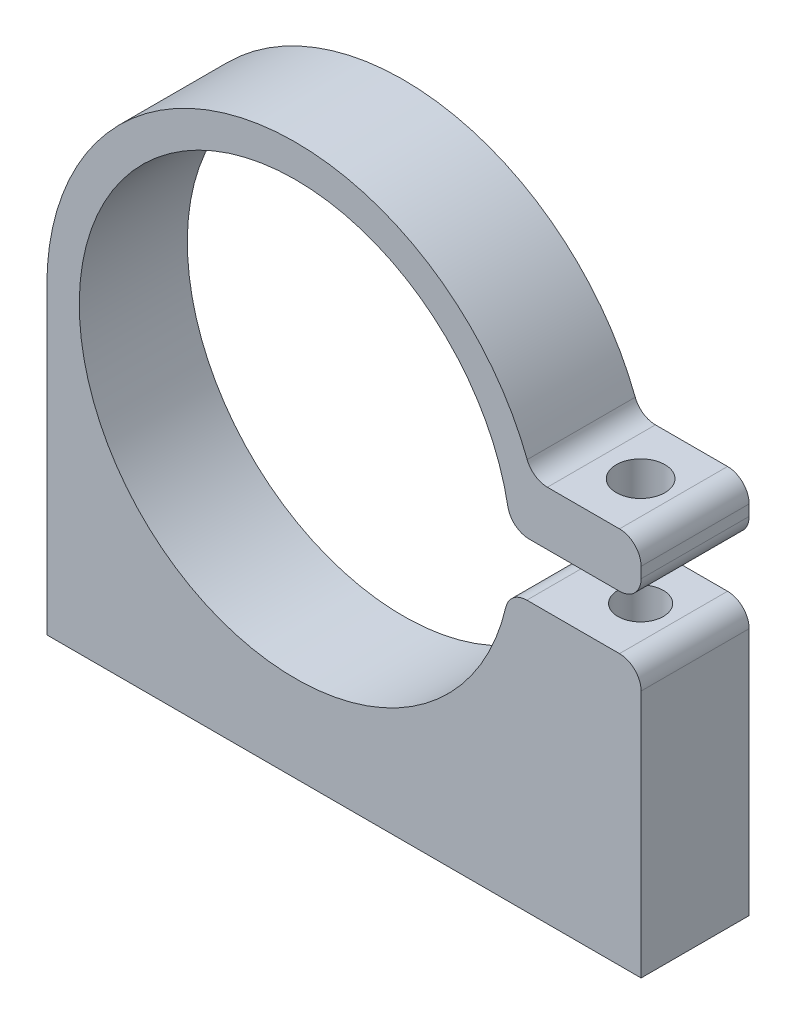
ISO-10303-21;
HEADER;
FILE_DESCRIPTION(('STEP AP214'),'2;1');
FILE_NAME('part.step','',(''),(''),'','','');
FILE_SCHEMA(('AUTOMOTIVE_DESIGN { 1 0 10303 214 1 1 1 1 }'));
ENDSEC;
DATA;
#1=APPLICATION_CONTEXT('core data for automotive mechanical design processes');
#2=APPLICATION_PROTOCOL_DEFINITION('international standard','automotive_design',2000,#1);
#3=PRODUCT_CONTEXT('',#1,'mechanical');
#4=PRODUCT('Part','Part','',(#3));
#5=PRODUCT_RELATED_PRODUCT_CATEGORY('part','',(#4));
#6=PRODUCT_DEFINITION_FORMATION('','',#4);
#7=PRODUCT_DEFINITION_CONTEXT('part definition',#1,'design');
#8=PRODUCT_DEFINITION('design','',#6,#7);
#9=PRODUCT_DEFINITION_SHAPE('','',#8);
#10=(LENGTH_UNIT() NAMED_UNIT(*) SI_UNIT(.MILLI.,.METRE.));
#11=(NAMED_UNIT(*) PLANE_ANGLE_UNIT() SI_UNIT($,.RADIAN.));
#12=(NAMED_UNIT(*) SI_UNIT($,.STERADIAN.) SOLID_ANGLE_UNIT());
#13=UNCERTAINTY_MEASURE_WITH_UNIT(LENGTH_MEASURE(1.E-05),#10,'distance_accuracy_value','');
#14=(GEOMETRIC_REPRESENTATION_CONTEXT(3) GLOBAL_UNCERTAINTY_ASSIGNED_CONTEXT((#13)) GLOBAL_UNIT_ASSIGNED_CONTEXT((#10,
#11,#12)) REPRESENTATION_CONTEXT('',''));
#15=CARTESIAN_POINT('',(0.,0.,0.));
#16=DIRECTION('',(0.,0.,1.));
#17=DIRECTION('',(1.,0.,0.));
#18=AXIS2_PLACEMENT_3D('',#15,#16,#17);
#19=CARTESIAN_POINT('',(32.,7.,10.));
#20=DIRECTION('',(0.,-1.,0.));
#21=DIRECTION('',(1.,0.,0.));
#22=AXIS2_PLACEMENT_3D('',#19,#20,#21);
#23=PLANE('',#22);
#24=DIRECTION('',(-1.,0.,0.));
#25=VECTOR('',#24,1.);
#26=CARTESIAN_POINT('',(32.,7.,10.));
#27=LINE('',#26,#25);
#28=CARTESIAN_POINT('',(30.,7.,10.));
#29=VERTEX_POINT('',#28);
#30=CARTESIAN_POINT('',(23.3238075793812,7.,10.));
#31=VERTEX_POINT('',#30);
#32=EDGE_CURVE('E195',#29,#31,#27,.T.);
#33=ORIENTED_EDGE('',*,*,#32,.F.);
#34=DIRECTION('',(0.,0.,-1.));
#35=VECTOR('',#34,1.);
#36=CARTESIAN_POINT('',(30.,7.,10.));
#37=LINE('',#36,#35);
#38=CARTESIAN_POINT('',(30.,7.,0.));
#39=VERTEX_POINT('',#38);
#40=EDGE_CURVE('E257',#29,#39,#37,.T.);
#41=ORIENTED_EDGE('',*,*,#40,.T.);
#42=DIRECTION('',(-1.,0.,0.));
#43=VECTOR('',#42,1.);
#44=CARTESIAN_POINT('',(32.,7.,0.));
#45=LINE('',#44,#43);
#46=CARTESIAN_POINT('',(23.3238075793812,7.,0.));
#47=VERTEX_POINT('',#46);
#48=EDGE_CURVE('E177',#39,#47,#45,.T.);
#49=ORIENTED_EDGE('',*,*,#48,.T.);
#50=DIRECTION('',(0.,0.,1.));
#51=VECTOR('',#50,1.);
#52=CARTESIAN_POINT('',(23.3238075793812,7.,10.));
#53=LINE('',#52,#51);
#54=EDGE_CURVE('E52',#47,#31,#53,.T.);
#55=ORIENTED_EDGE('',*,*,#54,.T.);
#56=EDGE_LOOP('',(#33,#41,#49,#55));
#57=FACE_BOUND('',#56,.T.);
#58=CARTESIAN_POINT('',(26.9544511501033,7.,5.));
#59=DIRECTION('',(0.,1.,0.));
#60=DIRECTION('',(0.,0.,1.));
#61=AXIS2_PLACEMENT_3D('',#58,#59,#60);
#62=CIRCLE('',#61,2.25);
#63=CARTESIAN_POINT('',(26.9544511501033,7.,7.25));
#64=VERTEX_POINT('',#63);
#65=EDGE_CURVE('E167',#64,#64,#62,.T.);
#66=ORIENTED_EDGE('',*,*,#65,.F.);
#67=EDGE_LOOP('',(#66));
#68=FACE_BOUND('',#67,.T.);
#69=ADVANCED_FACE('F37',(#57,#68),#23,.F.);
#70=CARTESIAN_POINT('',(0.,0.,10.));
#71=DIRECTION('',(0.,0.,-1.));
#72=DIRECTION('',(-1.,0.,0.));
#73=AXIS2_PLACEMENT_3D('',#70,#71,#72);
#74=CYLINDRICAL_SURFACE('',#73,23.);
#75=CARTESIAN_POINT('',(0.,0.,10.));
#76=DIRECTION('',(0.,0.,1.));
#77=DIRECTION('',(1.,0.,0.));
#78=AXIS2_PLACEMENT_3D('',#75,#76,#77);
#79=CIRCLE('',#78,23.);
#80=CARTESIAN_POINT('',(21.4579029730307,8.28,10.));
#81=VERTEX_POINT('',#80);
#82=CARTESIAN_POINT('',(-23.,0.,10.));
#83=VERTEX_POINT('',#82);
#84=EDGE_CURVE('E174',#81,#83,#79,.T.);
#85=ORIENTED_EDGE('',*,*,#84,.F.);
#86=DIRECTION('',(0.,0.,-1.));
#87=VECTOR('',#86,1.);
#88=CARTESIAN_POINT('',(21.4579029730307,8.28,10.));
#89=LINE('',#88,#87);
#90=CARTESIAN_POINT('',(21.4579029730307,8.28,0.));
#91=VERTEX_POINT('',#90);
#92=EDGE_CURVE('E272',#81,#91,#89,.T.);
#93=ORIENTED_EDGE('',*,*,#92,.T.);
#94=CARTESIAN_POINT('',(0.,0.,0.));
#95=DIRECTION('',(0.,0.,1.));
#96=DIRECTION('',(1.,0.,0.));
#97=AXIS2_PLACEMENT_3D('',#94,#95,#96);
#98=CIRCLE('',#97,23.);
#99=CARTESIAN_POINT('',(-23.,0.,0.));
#100=VERTEX_POINT('',#99);
#101=EDGE_CURVE('E173',#91,#100,#98,.T.);
#102=ORIENTED_EDGE('',*,*,#101,.T.);
#103=DIRECTION('',(0.,0.,-1.));
#104=VECTOR('',#103,1.);
#105=CARTESIAN_POINT('',(-23.,0.,10.));
#106=LINE('',#105,#104);
#107=EDGE_CURVE('E224',#83,#100,#106,.T.);
#108=ORIENTED_EDGE('',*,*,#107,.F.);
#109=EDGE_LOOP('',(#85,#93,#102,#108));
#110=FACE_BOUND('',#109,.T.);
#111=ADVANCED_FACE('F290',(#110),#74,.T.);
#112=CARTESIAN_POINT('',(-23.,0.,10.));
#113=DIRECTION('',(1.,0.,0.));
#114=DIRECTION('',(0.,1.,0.));
#115=AXIS2_PLACEMENT_3D('',#112,#113,#114);
#116=PLANE('',#115);
#117=DIRECTION('',(0.,-1.,0.));
#118=VECTOR('',#117,1.);
#119=CARTESIAN_POINT('',(-23.,0.,0.));
#120=LINE('',#119,#118);
#121=CARTESIAN_POINT('',(-23.,-28.,0.));
#122=VERTEX_POINT('',#121);
#123=EDGE_CURVE('E199',#100,#122,#120,.T.);
#124=ORIENTED_EDGE('',*,*,#123,.T.);
#125=DIRECTION('',(0.,0.,-1.));
#126=VECTOR('',#125,1.);
#127=CARTESIAN_POINT('',(-23.,-28.,10.));
#128=LINE('',#127,#126);
#129=CARTESIAN_POINT('',(-23.,-28.,10.));
#130=VERTEX_POINT('',#129);
#131=EDGE_CURVE('E221',#130,#122,#128,.T.);
#132=ORIENTED_EDGE('',*,*,#131,.F.);
#133=DIRECTION('',(0.,-1.,0.));
#134=VECTOR('',#133,1.);
#135=CARTESIAN_POINT('',(-23.,0.,10.));
#136=LINE('',#135,#134);
#137=EDGE_CURVE('E176',#83,#130,#136,.T.);
#138=ORIENTED_EDGE('',*,*,#137,.F.);
#139=ORIENTED_EDGE('',*,*,#107,.T.);
#140=EDGE_LOOP('',(#124,#132,#138,#139));
#141=FACE_BOUND('',#140,.T.);
#142=ADVANCED_FACE('F292',(#141),#116,.F.);
#143=CARTESIAN_POINT('',(-23.,-28.,10.));
#144=DIRECTION('',(0.,1.,0.));
#145=DIRECTION('',(0.,0.,1.));
#146=AXIS2_PLACEMENT_3D('',#143,#144,#145);
#147=PLANE('',#146);
#148=CARTESIAN_POINT('',(-15.,-28.,5.));
#149=DIRECTION('',(0.,-1.,0.));
#150=DIRECTION('',(0.,0.,-1.));
#151=AXIS2_PLACEMENT_3D('',#148,#149,#150);
#152=CIRCLE('',#151,2.1);
#153=CARTESIAN_POINT('',(-15.,-28.,2.9));
#154=VERTEX_POINT('',#153);
#155=EDGE_CURVE('E157',#154,#154,#152,.T.);
#156=ORIENTED_EDGE('',*,*,#155,.F.);
#157=EDGE_LOOP('',(#156));
#158=FACE_BOUND('',#157,.T.);
#159=CARTESIAN_POINT('',(26.9544511501033,-28.,5.));
#160=DIRECTION('',(0.,1.,0.));
#161=DIRECTION('',(0.,0.,1.));
#162=AXIS2_PLACEMENT_3D('',#159,#160,#161);
#163=CIRCLE('',#162,2.09999999999999);
#164=CARTESIAN_POINT('',(26.9544511501033,-28.,7.1));
#165=VERTEX_POINT('',#164);
#166=EDGE_CURVE('E160',#165,#165,#163,.T.);
#167=ORIENTED_EDGE('',*,*,#166,.T.);
#168=EDGE_LOOP('',(#167));
#169=FACE_BOUND('',#168,.T.);
#170=DIRECTION('',(1.,0.,0.));
#171=VECTOR('',#170,1.);
#172=CARTESIAN_POINT('',(-23.,-28.,0.));
#173=LINE('',#172,#171);
#174=CARTESIAN_POINT('',(32.,-28.,0.));
#175=VERTEX_POINT('',#174);
#176=EDGE_CURVE('E201',#122,#175,#173,.T.);
#177=ORIENTED_EDGE('',*,*,#176,.T.);
#178=DIRECTION('',(0.,0.,-1.));
#179=VECTOR('',#178,1.);
#180=CARTESIAN_POINT('',(32.,-28.,10.));
#181=LINE('',#180,#179);
#182=CARTESIAN_POINT('',(32.,-28.,10.));
#183=VERTEX_POINT('',#182);
#184=EDGE_CURVE('E197',#183,#175,#181,.T.);
#185=ORIENTED_EDGE('',*,*,#184,.F.);
#186=DIRECTION('',(1.,0.,0.));
#187=VECTOR('',#186,1.);
#188=CARTESIAN_POINT('',(-23.,-28.,10.));
#189=LINE('',#188,#187);
#190=EDGE_CURVE('E179',#130,#183,#189,.T.);
#191=ORIENTED_EDGE('',*,*,#190,.F.);
#192=ORIENTED_EDGE('',*,*,#131,.T.);
#193=EDGE_LOOP('',(#177,#185,#191,#192));
#194=FACE_BOUND('',#193,.T.);
#195=ADVANCED_FACE('F299',(#158,#169,#194),#147,.F.);
#196=CARTESIAN_POINT('',(32.,-3.,10.));
#197=DIRECTION('',(-1.,0.,0.));
#198=DIRECTION('',(0.,0.,1.));
#199=AXIS2_PLACEMENT_3D('',#196,#197,#198);
#200=PLANE('',#199);
#201=DIRECTION('',(0.,1.,0.));
#202=VECTOR('',#201,1.);
#203=CARTESIAN_POINT('',(32.,-3.,0.));
#204=LINE('',#203,#202);
#205=CARTESIAN_POINT('',(32.,-5.,0.));
#206=VERTEX_POINT('',#205);
#207=EDGE_CURVE('E203',#175,#206,#204,.T.);
#208=ORIENTED_EDGE('',*,*,#207,.T.);
#209=DIRECTION('',(0.,0.,-1.));
#210=VECTOR('',#209,1.);
#211=CARTESIAN_POINT('',(32.,-5.,10.));
#212=LINE('',#211,#210);
#213=CARTESIAN_POINT('',(32.,-5.,10.));
#214=VERTEX_POINT('',#213);
#215=EDGE_CURVE('E265',#206,#214,#212,.F.);
#216=ORIENTED_EDGE('',*,*,#215,.T.);
#217=DIRECTION('',(0.,1.,0.));
#218=VECTOR('',#217,1.);
#219=CARTESIAN_POINT('',(32.,-3.,10.));
#220=LINE('',#219,#218);
#221=EDGE_CURVE('E181',#183,#214,#220,.T.);
#222=ORIENTED_EDGE('',*,*,#221,.F.);
#223=ORIENTED_EDGE('',*,*,#184,.T.);
#224=EDGE_LOOP('',(#208,#216,#222,#223));
#225=FACE_BOUND('',#224,.T.);
#226=ADVANCED_FACE('F303',(#225),#200,.F.);
#227=CARTESIAN_POINT('',(32.,-3.,10.));
#228=DIRECTION('',(0.,-1.,0.));
#229=DIRECTION('',(1.,0.,0.));
#230=AXIS2_PLACEMENT_3D('',#227,#228,#229);
#231=PLANE('',#230);
#232=CARTESIAN_POINT('',(26.9544511501033,-3.,5.));
#233=DIRECTION('',(0.,1.,0.));
#234=DIRECTION('',(0.,0.,1.));
#235=AXIS2_PLACEMENT_3D('',#232,#233,#234);
#236=CIRCLE('',#235,2.09999999999999);
#237=CARTESIAN_POINT('',(26.9544511501033,-3.,7.09999999999999));
#238=VERTEX_POINT('',#237);
#239=EDGE_CURVE('E156',#238,#238,#236,.T.);
#240=ORIENTED_EDGE('',*,*,#239,.F.);
#241=EDGE_LOOP('',(#240));
#242=FACE_BOUND('',#241,.T.);
#243=DIRECTION('',(-1.,0.,0.));
#244=VECTOR('',#243,1.);
#245=CARTESIAN_POINT('',(32.,-3.,10.));
#246=LINE('',#245,#244);
#247=CARTESIAN_POINT('',(30.,-3.,10.));
#248=VERTEX_POINT('',#247);
#249=CARTESIAN_POINT('',(21.4242852856286,-3.,10.));
#250=VERTEX_POINT('',#249);
#251=EDGE_CURVE('E184',#248,#250,#246,.T.);
#252=ORIENTED_EDGE('',*,*,#251,.F.);
#253=DIRECTION('',(0.,0.,-1.));
#254=VECTOR('',#253,1.);
#255=CARTESIAN_POINT('',(30.,-3.,10.));
#256=LINE('',#255,#254);
#257=CARTESIAN_POINT('',(30.,-3.,0.));
#258=VERTEX_POINT('',#257);
#259=EDGE_CURVE('E262',#248,#258,#256,.T.);
#260=ORIENTED_EDGE('',*,*,#259,.T.);
#261=DIRECTION('',(-1.,0.,0.));
#262=VECTOR('',#261,1.);
#263=CARTESIAN_POINT('',(32.,-3.,0.));
#264=LINE('',#263,#262);
#265=CARTESIAN_POINT('',(21.4242852856286,-3.,0.));
#266=VERTEX_POINT('',#265);
#267=EDGE_CURVE('E206',#258,#266,#264,.T.);
#268=ORIENTED_EDGE('',*,*,#267,.T.);
#269=DIRECTION('',(0.,0.,-1.));
#270=VECTOR('',#269,1.);
#271=CARTESIAN_POINT('',(21.4242852856285,-3.,10.));
#272=LINE('',#271,#270);
#273=EDGE_CURVE('E260',#266,#250,#272,.F.);
#274=ORIENTED_EDGE('',*,*,#273,.T.);
#275=EDGE_LOOP('',(#252,#260,#268,#274));
#276=FACE_BOUND('',#275,.T.);
#277=ADVANCED_FACE('F311',(#242,#276),#231,.F.);
#278=CARTESIAN_POINT('',(0.,0.,10.));
#279=DIRECTION('',(0.,0.,-1.));
#280=DIRECTION('',(-1.,0.,0.));
#281=AXIS2_PLACEMENT_3D('',#278,#279,#280);
#282=CYLINDRICAL_SURFACE('',#281,20.);
#283=CARTESIAN_POINT('',(0.,0.,10.));
#284=DIRECTION('',(0.,0.,-1.));
#285=DIRECTION('',(1.,0.,0.));
#286=AXIS2_PLACEMENT_3D('',#283,#284,#285);
#287=CIRCLE('',#286,20.);
#288=CARTESIAN_POINT('',(19.476622986935,-4.54545454545455,10.));
#289=VERTEX_POINT('',#288);
#290=CARTESIAN_POINT('',(19.6666433207127,3.63636363636364,10.));
#291=VERTEX_POINT('',#290);
#292=EDGE_CURVE('E187',#289,#291,#287,.T.);
#293=ORIENTED_EDGE('',*,*,#292,.F.);
#294=DIRECTION('',(0.,0.,-1.));
#295=VECTOR('',#294,1.);
#296=CARTESIAN_POINT('',(19.476622986935,-4.54545454545455,10.));
#297=LINE('',#296,#295);
#298=CARTESIAN_POINT('',(19.476622986935,-4.54545454545455,0.));
#299=VERTEX_POINT('',#298);
#300=EDGE_CURVE('E269',#289,#299,#297,.T.);
#301=ORIENTED_EDGE('',*,*,#300,.T.);
#302=CARTESIAN_POINT('',(0.,0.,0.));
#303=DIRECTION('',(0.,0.,-1.));
#304=DIRECTION('',(1.,0.,0.));
#305=AXIS2_PLACEMENT_3D('',#302,#303,#304);
#306=CIRCLE('',#305,20.);
#307=CARTESIAN_POINT('',(19.6666433207127,3.63636363636364,0.));
#308=VERTEX_POINT('',#307);
#309=EDGE_CURVE('E209',#299,#308,#306,.T.);
#310=ORIENTED_EDGE('',*,*,#309,.T.);
#311=DIRECTION('',(0.,0.,-1.));
#312=VECTOR('',#311,1.);
#313=CARTESIAN_POINT('',(19.6666433207127,3.63636363636364,10.));
#314=LINE('',#313,#312);
#315=EDGE_CURVE('E267',#308,#291,#314,.F.);
#316=ORIENTED_EDGE('',*,*,#315,.T.);
#317=EDGE_LOOP('',(#293,#301,#310,#316));
#318=FACE_BOUND('',#317,.T.);
#319=ADVANCED_FACE('F320',(#318),#282,.F.);
#320=CARTESIAN_POINT('',(19.8997487421324,2.,10.));
#321=DIRECTION('',(0.,1.,0.));
#322=DIRECTION('',(0.,0.,1.));
#323=AXIS2_PLACEMENT_3D('',#320,#321,#322);
#324=PLANE('',#323);
#325=CARTESIAN_POINT('',(26.9544511501033,2.,5.));
#326=DIRECTION('',(0.,1.,0.));
#327=DIRECTION('',(0.,0.,1.));
#328=AXIS2_PLACEMENT_3D('',#325,#326,#327);
#329=CIRCLE('',#328,2.25);
#330=CARTESIAN_POINT('',(26.9544511501033,2.,7.25));
#331=VERTEX_POINT('',#330);
#332=EDGE_CURVE('E170',#331,#331,#329,.T.);
#333=ORIENTED_EDGE('',*,*,#332,.T.);
#334=EDGE_LOOP('',(#333));
#335=FACE_BOUND('',#334,.T.);
#336=DIRECTION('',(1.,0.,0.));
#337=VECTOR('',#336,1.);
#338=CARTESIAN_POINT('',(19.8997487421324,2.,0.));
#339=LINE('',#338,#337);
#340=CARTESIAN_POINT('',(21.6333076527839,2.,0.));
#341=VERTEX_POINT('',#340);
#342=CARTESIAN_POINT('',(30.,2.,0.));
#343=VERTEX_POINT('',#342);
#344=EDGE_CURVE('E212',#341,#343,#339,.T.);
#345=ORIENTED_EDGE('',*,*,#344,.T.);
#346=DIRECTION('',(0.,0.,-1.));
#347=VECTOR('',#346,1.);
#348=CARTESIAN_POINT('',(30.,2.,10.));
#349=LINE('',#348,#347);
#350=CARTESIAN_POINT('',(30.,2.,10.));
#351=VERTEX_POINT('',#350);
#352=EDGE_CURVE('E245',#343,#351,#349,.F.);
#353=ORIENTED_EDGE('',*,*,#352,.T.);
#354=DIRECTION('',(1.,0.,0.));
#355=VECTOR('',#354,1.);
#356=CARTESIAN_POINT('',(19.8997487421324,2.,10.));
#357=LINE('',#356,#355);
#358=CARTESIAN_POINT('',(21.6333076527839,2.,10.));
#359=VERTEX_POINT('',#358);
#360=EDGE_CURVE('E190',#359,#351,#357,.T.);
#361=ORIENTED_EDGE('',*,*,#360,.F.);
#362=DIRECTION('',(0.,0.,-1.));
#363=VECTOR('',#362,1.);
#364=CARTESIAN_POINT('',(21.6333076527839,2.,10.));
#365=LINE('',#364,#363);
#366=EDGE_CURVE('E242',#359,#341,#365,.T.);
#367=ORIENTED_EDGE('',*,*,#366,.T.);
#368=EDGE_LOOP('',(#345,#353,#361,#367));
#369=FACE_BOUND('',#368,.T.);
#370=ADVANCED_FACE('F329',(#335,#369),#324,.F.);
#371=CARTESIAN_POINT('',(32.,2.,10.));
#372=DIRECTION('',(-1.,0.,0.));
#373=DIRECTION('',(0.,0.,1.));
#374=AXIS2_PLACEMENT_3D('',#371,#372,#373);
#375=PLANE('',#374);
#376=DIRECTION('',(0.,1.,0.));
#377=VECTOR('',#376,1.);
#378=CARTESIAN_POINT('',(32.,2.,10.));
#379=LINE('',#378,#377);
#380=CARTESIAN_POINT('',(32.,4.,10.));
#381=VERTEX_POINT('',#380);
#382=CARTESIAN_POINT('',(32.,5.,10.));
#383=VERTEX_POINT('',#382);
#384=EDGE_CURVE('E193',#381,#383,#379,.T.);
#385=ORIENTED_EDGE('',*,*,#384,.F.);
#386=DIRECTION('',(0.,0.,-1.));
#387=VECTOR('',#386,1.);
#388=CARTESIAN_POINT('',(32.,4.,10.));
#389=LINE('',#388,#387);
#390=CARTESIAN_POINT('',(32.,4.,0.));
#391=VERTEX_POINT('',#390);
#392=EDGE_CURVE('E229',#381,#391,#389,.T.);
#393=ORIENTED_EDGE('',*,*,#392,.T.);
#394=DIRECTION('',(0.,1.,0.));
#395=VECTOR('',#394,1.);
#396=CARTESIAN_POINT('',(32.,2.,0.));
#397=LINE('',#396,#395);
#398=CARTESIAN_POINT('',(32.,5.,0.));
#399=VERTEX_POINT('',#398);
#400=EDGE_CURVE('E215',#391,#399,#397,.T.);
#401=ORIENTED_EDGE('',*,*,#400,.T.);
#402=DIRECTION('',(0.,0.,-1.));
#403=VECTOR('',#402,1.);
#404=CARTESIAN_POINT('',(32.,5.,10.));
#405=LINE('',#404,#403);
#406=EDGE_CURVE('E227',#399,#383,#405,.F.);
#407=ORIENTED_EDGE('',*,*,#406,.T.);
#408=EDGE_LOOP('',(#385,#393,#401,#407));
#409=FACE_BOUND('',#408,.T.);
#410=ADVANCED_FACE('F337',(#409),#375,.F.);
#411=CARTESIAN_POINT('',(0.,0.,10.));
#412=DIRECTION('',(0.,0.,1.));
#413=DIRECTION('',(1.,0.,0.));
#414=AXIS2_PLACEMENT_3D('',#411,#412,#413);
#415=PLANE('',#414);
#416=ORIENTED_EDGE('',*,*,#360,.T.);
#417=CARTESIAN_POINT('',(30.,4.,10.));
#418=DIRECTION('',(0.,0.,1.));
#419=DIRECTION('',(1.,0.,0.));
#420=AXIS2_PLACEMENT_3D('',#417,#418,#419);
#421=CIRCLE('',#420,2.);
#422=EDGE_CURVE('E254',#351,#381,#421,.T.);
#423=ORIENTED_EDGE('',*,*,#422,.T.);
#424=ORIENTED_EDGE('',*,*,#384,.T.);
#425=CARTESIAN_POINT('',(30.,5.,10.));
#426=DIRECTION('',(0.,0.,1.));
#427=DIRECTION('',(1.,0.,0.));
#428=AXIS2_PLACEMENT_3D('',#425,#426,#427);
#429=CIRCLE('',#428,2.);
#430=EDGE_CURVE('E59',#383,#29,#429,.T.);
#431=ORIENTED_EDGE('',*,*,#430,.T.);
#432=ORIENTED_EDGE('',*,*,#32,.T.);
#433=CARTESIAN_POINT('',(23.3238075793812,9.,10.));
#434=DIRECTION('',(0.,0.,1.));
#435=DIRECTION('',(1.,0.,0.));
#436=AXIS2_PLACEMENT_3D('',#433,#434,#435);
#437=CIRCLE('',#436,2.);
#438=EDGE_CURVE('E11',#31,#81,#437,.F.);
#439=ORIENTED_EDGE('',*,*,#438,.T.);
#440=ORIENTED_EDGE('',*,*,#84,.T.);
#441=ORIENTED_EDGE('',*,*,#137,.T.);
#442=ORIENTED_EDGE('',*,*,#190,.T.);
#443=ORIENTED_EDGE('',*,*,#221,.T.);
#444=CARTESIAN_POINT('',(30.,-5.,10.));
#445=DIRECTION('',(0.,0.,1.));
#446=DIRECTION('',(1.,0.,0.));
#447=AXIS2_PLACEMENT_3D('',#444,#445,#446);
#448=CIRCLE('',#447,2.);
#449=EDGE_CURVE('E251',#214,#248,#448,.T.);
#450=ORIENTED_EDGE('',*,*,#449,.T.);
#451=ORIENTED_EDGE('',*,*,#251,.T.);
#452=CARTESIAN_POINT('',(21.4242852856285,-5.,10.));
#453=DIRECTION('',(0.,0.,1.));
#454=DIRECTION('',(1.,0.,0.));
#455=AXIS2_PLACEMENT_3D('',#452,#453,#454);
#456=CIRCLE('',#455,2.);
#457=EDGE_CURVE('E249',#250,#289,#456,.T.);
#458=ORIENTED_EDGE('',*,*,#457,.T.);
#459=ORIENTED_EDGE('',*,*,#292,.T.);
#460=CARTESIAN_POINT('',(21.6333076527839,4.,10.));
#461=DIRECTION('',(0.,0.,1.));
#462=DIRECTION('',(1.,0.,0.));
#463=AXIS2_PLACEMENT_3D('',#460,#461,#462);
#464=CIRCLE('',#463,2.);
#465=EDGE_CURVE('E247',#291,#359,#464,.T.);
#466=ORIENTED_EDGE('',*,*,#465,.T.);
#467=EDGE_LOOP('',(#416,#423,#424,#431,#432,#439,#440,#441,#442,#443,#450,#451,#458,#459,#466));
#468=FACE_BOUND('',#467,.T.);
#469=ADVANCED_FACE('F286',(#468),#415,.T.);
#470=CARTESIAN_POINT('',(0.,0.,0.));
#471=DIRECTION('',(0.,0.,1.));
#472=DIRECTION('',(1.,0.,0.));
#473=AXIS2_PLACEMENT_3D('',#470,#471,#472);
#474=PLANE('',#473);
#475=ORIENTED_EDGE('',*,*,#400,.F.);
#476=CARTESIAN_POINT('',(30.,4.,0.));
#477=DIRECTION('',(0.,0.,1.));
#478=DIRECTION('',(1.,0.,0.));
#479=AXIS2_PLACEMENT_3D('',#476,#477,#478);
#480=CIRCLE('',#479,2.);
#481=EDGE_CURVE('E240',#391,#343,#480,.F.);
#482=ORIENTED_EDGE('',*,*,#481,.T.);
#483=ORIENTED_EDGE('',*,*,#344,.F.);
#484=CARTESIAN_POINT('',(21.6333076527839,4.,0.));
#485=DIRECTION('',(0.,0.,1.));
#486=DIRECTION('',(1.,0.,0.));
#487=AXIS2_PLACEMENT_3D('',#484,#485,#486);
#488=CIRCLE('',#487,2.);
#489=EDGE_CURVE('E232',#341,#308,#488,.F.);
#490=ORIENTED_EDGE('',*,*,#489,.T.);
#491=ORIENTED_EDGE('',*,*,#309,.F.);
#492=CARTESIAN_POINT('',(21.4242852856285,-5.,0.));
#493=DIRECTION('',(0.,0.,1.));
#494=DIRECTION('',(1.,0.,0.));
#495=AXIS2_PLACEMENT_3D('',#492,#493,#494);
#496=CIRCLE('',#495,2.);
#497=EDGE_CURVE('E234',#299,#266,#496,.F.);
#498=ORIENTED_EDGE('',*,*,#497,.T.);
#499=ORIENTED_EDGE('',*,*,#267,.F.);
#500=CARTESIAN_POINT('',(30.,-5.,0.));
#501=DIRECTION('',(0.,0.,1.));
#502=DIRECTION('',(1.,0.,0.));
#503=AXIS2_PLACEMENT_3D('',#500,#501,#502);
#504=CIRCLE('',#503,2.);
#505=EDGE_CURVE('E236',#258,#206,#504,.F.);
#506=ORIENTED_EDGE('',*,*,#505,.T.);
#507=ORIENTED_EDGE('',*,*,#207,.F.);
#508=ORIENTED_EDGE('',*,*,#176,.F.);
#509=ORIENTED_EDGE('',*,*,#123,.F.);
#510=ORIENTED_EDGE('',*,*,#101,.F.);
#511=CARTESIAN_POINT('',(23.3238075793812,9.,0.));
#512=DIRECTION('',(0.,0.,1.));
#513=DIRECTION('',(1.,0.,0.));
#514=AXIS2_PLACEMENT_3D('',#511,#512,#513);
#515=CIRCLE('',#514,2.);
#516=EDGE_CURVE('E45',#91,#47,#515,.T.);
#517=ORIENTED_EDGE('',*,*,#516,.T.);
#518=ORIENTED_EDGE('',*,*,#48,.F.);
#519=CARTESIAN_POINT('',(30.,5.,0.));
#520=DIRECTION('',(0.,0.,1.));
#521=DIRECTION('',(1.,0.,0.));
#522=AXIS2_PLACEMENT_3D('',#519,#520,#521);
#523=CIRCLE('',#522,2.);
#524=EDGE_CURVE('E238',#39,#399,#523,.F.);
#525=ORIENTED_EDGE('',*,*,#524,.T.);
#526=EDGE_LOOP('',(#475,#482,#483,#490,#491,#498,#499,#506,#507,#508,#509,#510,#517,#518,#525));
#527=FACE_BOUND('',#526,.T.);
#528=ADVANCED_FACE('F278',(#527),#474,.F.);
#529=CARTESIAN_POINT('',(30.,4.,10.));
#530=DIRECTION('',(0.,0.,-1.));
#531=DIRECTION('',(-1.,0.,0.));
#532=AXIS2_PLACEMENT_3D('',#529,#530,#531);
#533=CYLINDRICAL_SURFACE('',#532,2.);
#534=ORIENTED_EDGE('',*,*,#422,.F.);
#535=ORIENTED_EDGE('',*,*,#352,.F.);
#536=ORIENTED_EDGE('',*,*,#481,.F.);
#537=ORIENTED_EDGE('',*,*,#392,.F.);
#538=EDGE_LOOP('',(#534,#535,#536,#537));
#539=FACE_BOUND('',#538,.T.);
#540=ADVANCED_FACE('F333',(#539),#533,.T.);
#541=CARTESIAN_POINT('',(30.,5.,10.));
#542=DIRECTION('',(0.,0.,-1.));
#543=DIRECTION('',(-1.,0.,0.));
#544=AXIS2_PLACEMENT_3D('',#541,#542,#543);
#545=CYLINDRICAL_SURFACE('',#544,2.);
#546=ORIENTED_EDGE('',*,*,#430,.F.);
#547=ORIENTED_EDGE('',*,*,#406,.F.);
#548=ORIENTED_EDGE('',*,*,#524,.F.);
#549=ORIENTED_EDGE('',*,*,#40,.F.);
#550=EDGE_LOOP('',(#546,#547,#548,#549));
#551=FACE_BOUND('',#550,.T.);
#552=ADVANCED_FACE('F340',(#551),#545,.T.);
#553=CARTESIAN_POINT('',(30.,-5.,10.));
#554=DIRECTION('',(0.,0.,-1.));
#555=DIRECTION('',(-1.,0.,0.));
#556=AXIS2_PLACEMENT_3D('',#553,#554,#555);
#557=CYLINDRICAL_SURFACE('',#556,2.);
#558=ORIENTED_EDGE('',*,*,#449,.F.);
#559=ORIENTED_EDGE('',*,*,#215,.F.);
#560=ORIENTED_EDGE('',*,*,#505,.F.);
#561=ORIENTED_EDGE('',*,*,#259,.F.);
#562=EDGE_LOOP('',(#558,#559,#560,#561));
#563=FACE_BOUND('',#562,.T.);
#564=ADVANCED_FACE('F306',(#563),#557,.T.);
#565=CARTESIAN_POINT('',(21.4242852856285,-5.,10.));
#566=DIRECTION('',(0.,0.,-1.));
#567=DIRECTION('',(-1.,0.,0.));
#568=AXIS2_PLACEMENT_3D('',#565,#566,#567);
#569=CYLINDRICAL_SURFACE('',#568,2.);
#570=ORIENTED_EDGE('',*,*,#457,.F.);
#571=ORIENTED_EDGE('',*,*,#273,.F.);
#572=ORIENTED_EDGE('',*,*,#497,.F.);
#573=ORIENTED_EDGE('',*,*,#300,.F.);
#574=EDGE_LOOP('',(#570,#571,#572,#573));
#575=FACE_BOUND('',#574,.T.);
#576=ADVANCED_FACE('F315',(#575),#569,.T.);
#577=CARTESIAN_POINT('',(21.6333076527839,4.,10.));
#578=DIRECTION('',(0.,0.,-1.));
#579=DIRECTION('',(-1.,0.,0.));
#580=AXIS2_PLACEMENT_3D('',#577,#578,#579);
#581=CYLINDRICAL_SURFACE('',#580,2.);
#582=ORIENTED_EDGE('',*,*,#465,.F.);
#583=ORIENTED_EDGE('',*,*,#315,.F.);
#584=ORIENTED_EDGE('',*,*,#489,.F.);
#585=ORIENTED_EDGE('',*,*,#366,.F.);
#586=EDGE_LOOP('',(#582,#583,#584,#585));
#587=FACE_BOUND('',#586,.T.);
#588=ADVANCED_FACE('F324',(#587),#581,.T.);
#589=CARTESIAN_POINT('',(23.3238075793812,9.,10.));
#590=DIRECTION('',(0.,0.,-1.));
#591=DIRECTION('',(-1.,0.,0.));
#592=AXIS2_PLACEMENT_3D('',#589,#590,#591);
#593=CYLINDRICAL_SURFACE('',#592,2.);
#594=ORIENTED_EDGE('',*,*,#438,.F.);
#595=ORIENTED_EDGE('',*,*,#54,.F.);
#596=ORIENTED_EDGE('',*,*,#516,.F.);
#597=ORIENTED_EDGE('',*,*,#92,.F.);
#598=EDGE_LOOP('',(#594,#595,#596,#597));
#599=FACE_BOUND('',#598,.T.);
#600=ADVANCED_FACE('F39',(#599),#593,.F.);
#601=CARTESIAN_POINT('',(26.9544511501033,7.,5.));
#602=DIRECTION('',(0.,1.,0.));
#603=DIRECTION('',(0.,0.,1.));
#604=AXIS2_PLACEMENT_3D('',#601,#602,#603);
#605=CYLINDRICAL_SURFACE('',#604,2.25);
#606=ORIENTED_EDGE('',*,*,#332,.F.);
#607=EDGE_LOOP('',(#606));
#608=FACE_BOUND('',#607,.T.);
#609=ORIENTED_EDGE('',*,*,#65,.T.);
#610=EDGE_LOOP('',(#609));
#611=FACE_BOUND('',#610,.T.);
#612=ADVANCED_FACE('F452',(#608,#611),#605,.F.);
#613=CARTESIAN_POINT('',(26.9544511501033,-3.,5.));
#614=DIRECTION('',(0.,1.,0.));
#615=DIRECTION('',(0.,0.,1.));
#616=AXIS2_PLACEMENT_3D('',#613,#614,#615);
#617=CYLINDRICAL_SURFACE('',#616,2.09999999999999);
#618=ORIENTED_EDGE('',*,*,#166,.F.);
#619=EDGE_LOOP('',(#618));
#620=FACE_BOUND('',#619,.T.);
#621=ORIENTED_EDGE('',*,*,#239,.T.);
#622=EDGE_LOOP('',(#621));
#623=FACE_BOUND('',#622,.T.);
#624=ADVANCED_FACE('F150',(#620,#623),#617,.F.);
#625=CARTESIAN_POINT('',(-15.,-18.,5.));
#626=DIRECTION('',(0.,-1.,0.));
#627=DIRECTION('',(0.,0.,-1.));
#628=AXIS2_PLACEMENT_3D('',#625,#626,#627);
#629=CONICAL_SURFACE('',#628,2.1,1.02974425867665);
#630=CARTESIAN_POINT('',(-15.,-16.7381927000421,5.));
#631=VERTEX_POINT('',#630);
#632=VERTEX_LOOP('',#631);
#633=FACE_BOUND('',#632,.T.);
#634=CARTESIAN_POINT('',(-15.,-18.,5.));
#635=DIRECTION('',(0.,-1.,0.));
#636=DIRECTION('',(0.,0.,-1.));
#637=AXIS2_PLACEMENT_3D('',#634,#635,#636);
#638=CIRCLE('',#637,2.1);
#639=CARTESIAN_POINT('',(-15.,-18.,2.9));
#640=VERTEX_POINT('',#639);
#641=EDGE_CURVE('E154',#640,#640,#638,.T.);
#642=ORIENTED_EDGE('',*,*,#641,.T.);
#643=EDGE_LOOP('',(#642));
#644=FACE_BOUND('',#643,.T.);
#645=ADVANCED_FACE('F146',(#633,#644),#629,.F.);
#646=CARTESIAN_POINT('',(-15.,-28.,5.));
#647=DIRECTION('',(0.,-1.,0.));
#648=DIRECTION('',(0.,0.,-1.));
#649=AXIS2_PLACEMENT_3D('',#646,#647,#648);
#650=CYLINDRICAL_SURFACE('',#649,2.1);
#651=ORIENTED_EDGE('',*,*,#641,.F.);
#652=EDGE_LOOP('',(#651));
#653=FACE_BOUND('',#652,.T.);
#654=ORIENTED_EDGE('',*,*,#155,.T.);
#655=EDGE_LOOP('',(#654));
#656=FACE_BOUND('',#655,.T.);
#657=ADVANCED_FACE('F149',(#653,#656),#650,.F.);
#658=CLOSED_SHELL('',(#69,#111,#142,#195,#226,#277,#319,#370,#410,#469,#528,#540,#552,#564,#576,
#588,#600,#612,#624,#645,#657));
#659=MANIFOLD_SOLID_BREP('B2',#658);
#660=ADVANCED_BREP_SHAPE_REPRESENTATION('',(#18,#659),#14);
#661=SHAPE_DEFINITION_REPRESENTATION(#9,#660);
ENDSEC;
END-ISO-10303-21;
